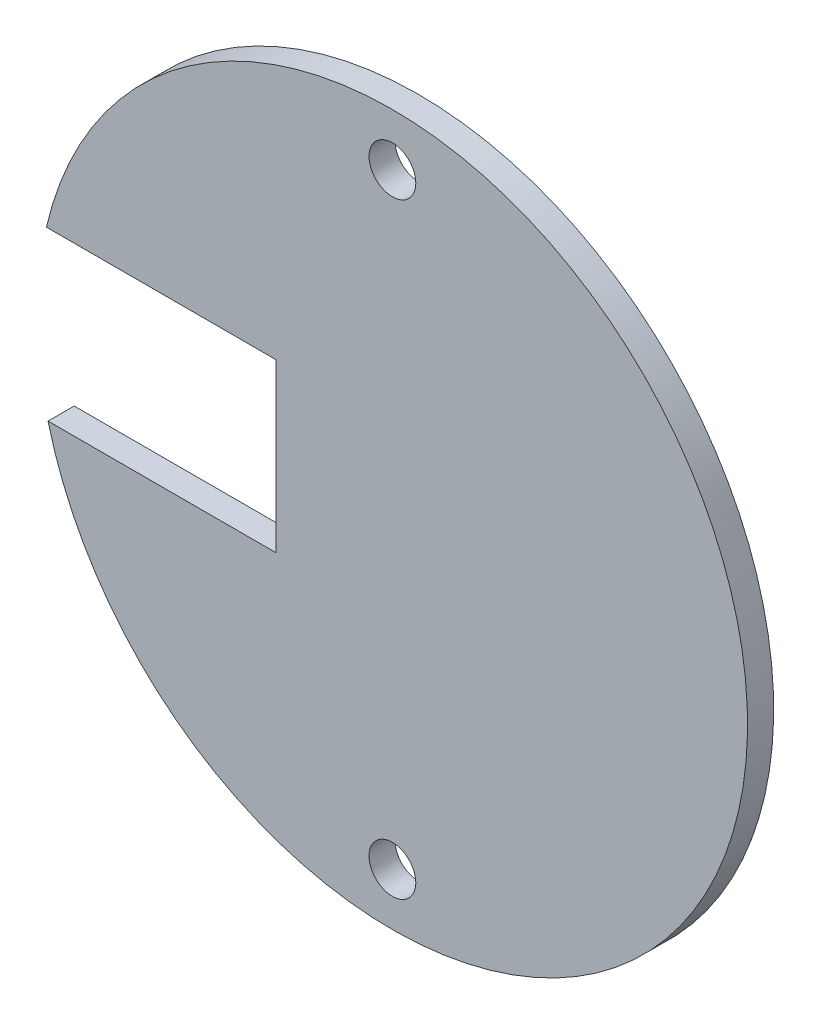
ISO-10303-21;
HEADER;
FILE_DESCRIPTION(('STEP AP214'),'2;1');
FILE_NAME('part.step','',(''),(''),'','','');
FILE_SCHEMA(('AUTOMOTIVE_DESIGN { 1 0 10303 214 1 1 1 1 }'));
ENDSEC;
DATA;
#1=APPLICATION_CONTEXT('core data for automotive mechanical design processes');
#2=APPLICATION_PROTOCOL_DEFINITION('international standard','automotive_design',2000,#1);
#3=PRODUCT_CONTEXT('',#1,'mechanical');
#4=PRODUCT('Part','Part','',(#3));
#5=PRODUCT_RELATED_PRODUCT_CATEGORY('part','',(#4));
#6=PRODUCT_DEFINITION_FORMATION('','',#4);
#7=PRODUCT_DEFINITION_CONTEXT('part definition',#1,'design');
#8=PRODUCT_DEFINITION('design','',#6,#7);
#9=PRODUCT_DEFINITION_SHAPE('','',#8);
#10=(LENGTH_UNIT() NAMED_UNIT(*) SI_UNIT(.MILLI.,.METRE.));
#11=(NAMED_UNIT(*) PLANE_ANGLE_UNIT() SI_UNIT($,.RADIAN.));
#12=(NAMED_UNIT(*) SI_UNIT($,.STERADIAN.) SOLID_ANGLE_UNIT());
#13=UNCERTAINTY_MEASURE_WITH_UNIT(LENGTH_MEASURE(1.E-05),#10,'distance_accuracy_value','');
#14=(GEOMETRIC_REPRESENTATION_CONTEXT(3) GLOBAL_UNCERTAINTY_ASSIGNED_CONTEXT((#13)) GLOBAL_UNIT_ASSIGNED_CONTEXT((#10,
#11,#12)) REPRESENTATION_CONTEXT('',''));
#15=CARTESIAN_POINT('',(0.,0.,0.));
#16=DIRECTION('',(0.,0.,1.));
#17=DIRECTION('',(1.,0.,0.));
#18=AXIS2_PLACEMENT_3D('',#15,#16,#17);
#19=CARTESIAN_POINT('',(0.,0.,1.5875));
#20=DIRECTION('',(0.,0.,1.));
#21=DIRECTION('',(1.,0.,0.));
#22=AXIS2_PLACEMENT_3D('',#19,#20,#21);
#23=PLANE('',#22);
#24=CARTESIAN_POINT('',(0.,18.415,1.5875));
#25=DIRECTION('',(0.,0.,1.));
#26=DIRECTION('',(1.,0.,0.));
#27=AXIS2_PLACEMENT_3D('',#24,#25,#26);
#28=CIRCLE('',#27,1.4224);
#29=CARTESIAN_POINT('',(1.4224,18.415,1.5875));
#30=VERTEX_POINT('',#29);
#31=EDGE_CURVE('E99',#30,#30,#28,.T.);
#32=ORIENTED_EDGE('',*,*,#31,.F.);
#33=EDGE_LOOP('',(#32));
#34=FACE_BOUND('',#33,.T.);
#35=CARTESIAN_POINT('',(0.,0.,1.5875));
#36=DIRECTION('',(0.,0.,1.));
#37=DIRECTION('',(1.,0.,0.));
#38=AXIS2_PLACEMENT_3D('',#35,#36,#37);
#39=CIRCLE('',#38,21.59);
#40=CARTESIAN_POINT('',(-20.9336068980002,-5.2832,1.5875));
#41=VERTEX_POINT('',#40);
#42=CARTESIAN_POINT('',(-21.0319975694179,4.8768,1.5875));
#43=VERTEX_POINT('',#42);
#44=EDGE_CURVE('E84',#41,#43,#39,.T.);
#45=ORIENTED_EDGE('',*,*,#44,.T.);
#46=DIRECTION('',(1.,0.,0.));
#47=VECTOR('',#46,1.);
#48=CARTESIAN_POINT('',(-21.0319975694179,4.8768,1.5875));
#49=LINE('',#48,#47);
#50=CARTESIAN_POINT('',(-7.08496533764944,4.8768,1.5875));
#51=VERTEX_POINT('',#50);
#52=EDGE_CURVE('E79',#43,#51,#49,.T.);
#53=ORIENTED_EDGE('',*,*,#52,.T.);
#54=DIRECTION('',(0.,-1.,0.));
#55=VECTOR('',#54,1.);
#56=CARTESIAN_POINT('',(-7.08496533764944,4.8768,1.5875));
#57=LINE('',#56,#55);
#58=CARTESIAN_POINT('',(-7.08496533764946,-5.2832,1.5875));
#59=VERTEX_POINT('',#58);
#60=EDGE_CURVE('E82',#51,#59,#57,.T.);
#61=ORIENTED_EDGE('',*,*,#60,.T.);
#62=DIRECTION('',(-1.,0.,0.));
#63=VECTOR('',#62,1.);
#64=CARTESIAN_POINT('',(-7.08496533764946,-5.2832,1.5875));
#65=LINE('',#64,#63);
#66=EDGE_CURVE('E49',#59,#41,#65,.T.);
#67=ORIENTED_EDGE('',*,*,#66,.T.);
#68=EDGE_LOOP('',(#45,#53,#61,#67));
#69=FACE_BOUND('',#68,.T.);
#70=CARTESIAN_POINT('',(0.,-18.415,1.5875));
#71=DIRECTION('',(0.,0.,1.));
#72=DIRECTION('',(1.,0.,0.));
#73=AXIS2_PLACEMENT_3D('',#70,#71,#72);
#74=CIRCLE('',#73,1.4224);
#75=CARTESIAN_POINT('',(1.4224,-18.415,1.5875));
#76=VERTEX_POINT('',#75);
#77=EDGE_CURVE('E114',#76,#76,#74,.T.);
#78=ORIENTED_EDGE('',*,*,#77,.F.);
#79=EDGE_LOOP('',(#78));
#80=FACE_BOUND('',#79,.T.);
#81=ADVANCED_FACE('F32',(#34,#69,#80),#23,.T.);
#82=CARTESIAN_POINT('',(0.,0.,0.));
#83=DIRECTION('',(0.,0.,1.));
#84=DIRECTION('',(1.,0.,0.));
#85=AXIS2_PLACEMENT_3D('',#82,#83,#84);
#86=PLANE('',#85);
#87=CARTESIAN_POINT('',(0.,18.415,0.));
#88=DIRECTION('',(0.,0.,1.));
#89=DIRECTION('',(1.,0.,0.));
#90=AXIS2_PLACEMENT_3D('',#87,#88,#89);
#91=CIRCLE('',#90,1.4224);
#92=CARTESIAN_POINT('',(1.4224,18.415,0.));
#93=VERTEX_POINT('',#92);
#94=EDGE_CURVE('E111',#93,#93,#91,.T.);
#95=ORIENTED_EDGE('',*,*,#94,.T.);
#96=EDGE_LOOP('',(#95));
#97=FACE_BOUND('',#96,.T.);
#98=CARTESIAN_POINT('',(0.,0.,0.));
#99=DIRECTION('',(0.,0.,1.));
#100=DIRECTION('',(1.,0.,0.));
#101=AXIS2_PLACEMENT_3D('',#98,#99,#100);
#102=CIRCLE('',#101,21.59);
#103=CARTESIAN_POINT('',(-20.9336068980002,-5.2832,0.));
#104=VERTEX_POINT('',#103);
#105=CARTESIAN_POINT('',(-21.0319975694179,4.8768,0.));
#106=VERTEX_POINT('',#105);
#107=EDGE_CURVE('E96',#104,#106,#102,.T.);
#108=ORIENTED_EDGE('',*,*,#107,.F.);
#109=DIRECTION('',(-1.,0.,0.));
#110=VECTOR('',#109,1.);
#111=CARTESIAN_POINT('',(-7.08496533764946,-5.2832,0.));
#112=LINE('',#111,#110);
#113=CARTESIAN_POINT('',(-7.08496533764946,-5.2832,0.));
#114=VERTEX_POINT('',#113);
#115=EDGE_CURVE('E72',#114,#104,#112,.T.);
#116=ORIENTED_EDGE('',*,*,#115,.F.);
#117=DIRECTION('',(0.,-1.,0.));
#118=VECTOR('',#117,1.);
#119=CARTESIAN_POINT('',(-7.08496533764944,4.8768,0.));
#120=LINE('',#119,#118);
#121=CARTESIAN_POINT('',(-7.08496533764944,4.8768,0.));
#122=VERTEX_POINT('',#121);
#123=EDGE_CURVE('E66',#122,#114,#120,.T.);
#124=ORIENTED_EDGE('',*,*,#123,.F.);
#125=DIRECTION('',(1.,0.,0.));
#126=VECTOR('',#125,1.);
#127=CARTESIAN_POINT('',(-21.0319975694179,4.8768,0.));
#128=LINE('',#127,#126);
#129=EDGE_CURVE('E88',#106,#122,#128,.T.);
#130=ORIENTED_EDGE('',*,*,#129,.F.);
#131=EDGE_LOOP('',(#108,#116,#124,#130));
#132=FACE_BOUND('',#131,.T.);
#133=CARTESIAN_POINT('',(0.,-18.415,0.));
#134=DIRECTION('',(0.,0.,1.));
#135=DIRECTION('',(1.,0.,0.));
#136=AXIS2_PLACEMENT_3D('',#133,#134,#135);
#137=CIRCLE('',#136,1.4224);
#138=CARTESIAN_POINT('',(1.4224,-18.415,0.));
#139=VERTEX_POINT('',#138);
#140=EDGE_CURVE('E117',#139,#139,#137,.T.);
#141=ORIENTED_EDGE('',*,*,#140,.T.);
#142=EDGE_LOOP('',(#141));
#143=FACE_BOUND('',#142,.T.);
#144=ADVANCED_FACE('F107',(#97,#132,#143),#86,.F.);
#145=CARTESIAN_POINT('',(0.,0.,1.5875));
#146=DIRECTION('',(0.,0.,-1.));
#147=DIRECTION('',(-1.,0.,0.));
#148=AXIS2_PLACEMENT_3D('',#145,#146,#147);
#149=CYLINDRICAL_SURFACE('',#148,21.59);
#150=ORIENTED_EDGE('',*,*,#107,.T.);
#151=DIRECTION('',(0.,0.,-1.));
#152=VECTOR('',#151,1.);
#153=CARTESIAN_POINT('',(-21.0319975694179,4.8768,1.5875));
#154=LINE('',#153,#152);
#155=EDGE_CURVE('E11',#43,#106,#154,.T.);
#156=ORIENTED_EDGE('',*,*,#155,.F.);
#157=ORIENTED_EDGE('',*,*,#44,.F.);
#158=DIRECTION('',(0.,0.,-1.));
#159=VECTOR('',#158,1.);
#160=CARTESIAN_POINT('',(-20.9336068980002,-5.2832,1.5875));
#161=LINE('',#160,#159);
#162=EDGE_CURVE('E92',#41,#104,#161,.T.);
#163=ORIENTED_EDGE('',*,*,#162,.T.);
#164=EDGE_LOOP('',(#150,#156,#157,#163));
#165=FACE_BOUND('',#164,.T.);
#166=ADVANCED_FACE('F34',(#165),#149,.T.);
#167=CARTESIAN_POINT('',(-21.0319975694179,4.8768,1.5875));
#168=DIRECTION('',(0.,1.,0.));
#169=DIRECTION('',(-1.,0.,0.));
#170=AXIS2_PLACEMENT_3D('',#167,#168,#169);
#171=PLANE('',#170);
#172=ORIENTED_EDGE('',*,*,#129,.T.);
#173=DIRECTION('',(0.,0.,-1.));
#174=VECTOR('',#173,1.);
#175=CARTESIAN_POINT('',(-7.08496533764944,4.8768,1.5875));
#176=LINE('',#175,#174);
#177=EDGE_CURVE('E41',#51,#122,#176,.T.);
#178=ORIENTED_EDGE('',*,*,#177,.F.);
#179=ORIENTED_EDGE('',*,*,#52,.F.);
#180=ORIENTED_EDGE('',*,*,#155,.T.);
#181=EDGE_LOOP('',(#172,#178,#179,#180));
#182=FACE_BOUND('',#181,.T.);
#183=ADVANCED_FACE('F87',(#182),#171,.F.);
#184=CARTESIAN_POINT('',(-7.08496533764944,4.8768,1.5875));
#185=DIRECTION('',(1.,0.,0.));
#186=DIRECTION('',(0.,1.,0.));
#187=AXIS2_PLACEMENT_3D('',#184,#185,#186);
#188=PLANE('',#187);
#189=ORIENTED_EDGE('',*,*,#123,.T.);
#190=DIRECTION('',(0.,0.,-1.));
#191=VECTOR('',#190,1.);
#192=CARTESIAN_POINT('',(-7.08496533764946,-5.2832,1.5875));
#193=LINE('',#192,#191);
#194=EDGE_CURVE('E89',#59,#114,#193,.T.);
#195=ORIENTED_EDGE('',*,*,#194,.F.);
#196=ORIENTED_EDGE('',*,*,#60,.F.);
#197=ORIENTED_EDGE('',*,*,#177,.T.);
#198=EDGE_LOOP('',(#189,#195,#196,#197));
#199=FACE_BOUND('',#198,.T.);
#200=ADVANCED_FACE('F90',(#199),#188,.F.);
#201=CARTESIAN_POINT('',(-7.08496533764946,-5.2832,1.5875));
#202=DIRECTION('',(0.,-1.,0.));
#203=DIRECTION('',(1.,0.,0.));
#204=AXIS2_PLACEMENT_3D('',#201,#202,#203);
#205=PLANE('',#204);
#206=ORIENTED_EDGE('',*,*,#115,.T.);
#207=ORIENTED_EDGE('',*,*,#162,.F.);
#208=ORIENTED_EDGE('',*,*,#66,.F.);
#209=ORIENTED_EDGE('',*,*,#194,.T.);
#210=EDGE_LOOP('',(#206,#207,#208,#209));
#211=FACE_BOUND('',#210,.T.);
#212=ADVANCED_FACE('F104',(#211),#205,.F.);
#213=CARTESIAN_POINT('',(0.,18.415,1.5875));
#214=DIRECTION('',(0.,0.,-1.));
#215=DIRECTION('',(-1.,0.,0.));
#216=AXIS2_PLACEMENT_3D('',#213,#214,#215);
#217=CYLINDRICAL_SURFACE('',#216,1.4224);
#218=ORIENTED_EDGE('',*,*,#31,.T.);
#219=EDGE_LOOP('',(#218));
#220=FACE_BOUND('',#219,.T.);
#221=ORIENTED_EDGE('',*,*,#94,.F.);
#222=EDGE_LOOP('',(#221));
#223=FACE_BOUND('',#222,.T.);
#224=ADVANCED_FACE('F135',(#220,#223),#217,.F.);
#225=CARTESIAN_POINT('',(0.,-18.415,1.5875));
#226=DIRECTION('',(0.,0.,-1.));
#227=DIRECTION('',(-1.,0.,0.));
#228=AXIS2_PLACEMENT_3D('',#225,#226,#227);
#229=CYLINDRICAL_SURFACE('',#228,1.4224);
#230=ORIENTED_EDGE('',*,*,#77,.T.);
#231=EDGE_LOOP('',(#230));
#232=FACE_BOUND('',#231,.T.);
#233=ORIENTED_EDGE('',*,*,#140,.F.);
#234=EDGE_LOOP('',(#233));
#235=FACE_BOUND('',#234,.T.);
#236=ADVANCED_FACE('F123',(#232,#235),#229,.F.);
#237=CLOSED_SHELL('',(#81,#144,#166,#183,#200,#212,#224,#236));
#238=MANIFOLD_SOLID_BREP('B2',#237);
#239=ADVANCED_BREP_SHAPE_REPRESENTATION('',(#18,#238),#14);
#240=SHAPE_DEFINITION_REPRESENTATION(#9,#239);
ENDSEC;
END-ISO-10303-21;
